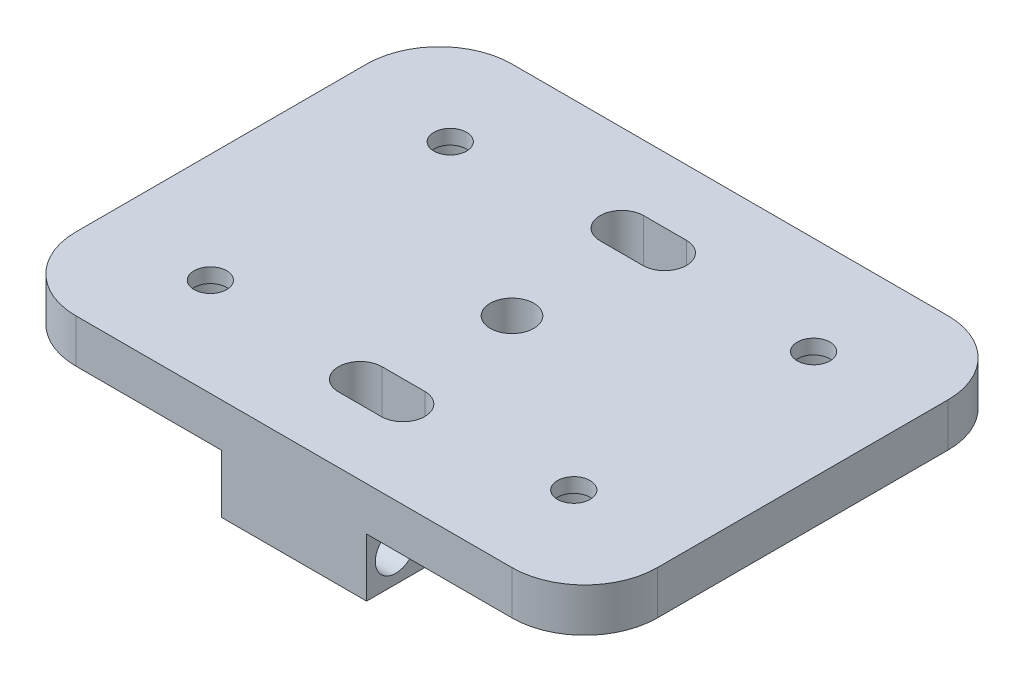
ISO-10303-21;
HEADER;
FILE_DESCRIPTION(('STEP AP214'),'2;1');
FILE_NAME('part.step','',(''),(''),'','','');
FILE_SCHEMA(('AUTOMOTIVE_DESIGN { 1 0 10303 214 1 1 1 1 }'));
ENDSEC;
DATA;
#1=APPLICATION_CONTEXT('core data for automotive mechanical design processes');
#2=APPLICATION_PROTOCOL_DEFINITION('international standard','automotive_design',2000,#1);
#3=PRODUCT_CONTEXT('',#1,'mechanical');
#4=PRODUCT('Part','Part','',(#3));
#5=PRODUCT_RELATED_PRODUCT_CATEGORY('part','',(#4));
#6=PRODUCT_DEFINITION_FORMATION('','',#4);
#7=PRODUCT_DEFINITION_CONTEXT('part definition',#1,'design');
#8=PRODUCT_DEFINITION('design','',#6,#7);
#9=PRODUCT_DEFINITION_SHAPE('','',#8);
#10=(LENGTH_UNIT() NAMED_UNIT(*) SI_UNIT(.MILLI.,.METRE.));
#11=(NAMED_UNIT(*) PLANE_ANGLE_UNIT() SI_UNIT($,.RADIAN.));
#12=(NAMED_UNIT(*) SI_UNIT($,.STERADIAN.) SOLID_ANGLE_UNIT());
#13=UNCERTAINTY_MEASURE_WITH_UNIT(LENGTH_MEASURE(1.E-05),#10,'distance_accuracy_value','');
#14=(GEOMETRIC_REPRESENTATION_CONTEXT(3) GLOBAL_UNCERTAINTY_ASSIGNED_CONTEXT((#13)) GLOBAL_UNIT_ASSIGNED_CONTEXT((#10,
#11,#12)) REPRESENTATION_CONTEXT('',''));
#15=CARTESIAN_POINT('',(0.,0.,0.));
#16=DIRECTION('',(0.,0.,1.));
#17=DIRECTION('',(1.,0.,0.));
#18=AXIS2_PLACEMENT_3D('',#15,#16,#17);
#19=CARTESIAN_POINT('',(-25.,6.,16.5));
#20=DIRECTION('',(0.,-1.,0.));
#21=DIRECTION('',(0.,0.,-1.));
#22=AXIS2_PLACEMENT_3D('',#19,#20,#21);
#23=CYLINDRICAL_SURFACE('',#22,2.25);
#24=CARTESIAN_POINT('',(-25.,6.,16.5));
#25=DIRECTION('',(0.,1.,0.));
#26=DIRECTION('',(0.,0.,1.));
#27=AXIS2_PLACEMENT_3D('',#24,#25,#26);
#28=CIRCLE('',#27,2.25);
#29=CARTESIAN_POINT('',(-25.,6.,18.75));
#30=VERTEX_POINT('',#29);
#31=EDGE_CURVE('E329',#30,#30,#28,.T.);
#32=ORIENTED_EDGE('',*,*,#31,.T.);
#33=EDGE_LOOP('',(#32));
#34=FACE_BOUND('',#33,.T.);
#35=CARTESIAN_POINT('',(-25.,4.,16.5));
#36=DIRECTION('',(0.,-1.,0.));
#37=DIRECTION('',(0.,0.,-1.));
#38=AXIS2_PLACEMENT_3D('',#35,#36,#37);
#39=CIRCLE('',#38,2.25);
#40=CARTESIAN_POINT('',(-25.,4.,14.25));
#41=VERTEX_POINT('',#40);
#42=EDGE_CURVE('E42',#41,#41,#39,.T.);
#43=ORIENTED_EDGE('',*,*,#42,.T.);
#44=EDGE_LOOP('',(#43));
#45=FACE_BOUND('',#44,.T.);
#46=ADVANCED_FACE('F38',(#34,#45),#23,.F.);
#47=CARTESIAN_POINT('',(25.,6.,16.5));
#48=DIRECTION('',(0.,-1.,0.));
#49=DIRECTION('',(0.,0.,-1.));
#50=AXIS2_PLACEMENT_3D('',#47,#48,#49);
#51=CYLINDRICAL_SURFACE('',#50,2.25);
#52=CARTESIAN_POINT('',(25.,6.,16.5));
#53=DIRECTION('',(0.,1.,0.));
#54=DIRECTION('',(0.,0.,1.));
#55=AXIS2_PLACEMENT_3D('',#52,#53,#54);
#56=CIRCLE('',#55,2.25);
#57=CARTESIAN_POINT('',(25.,6.,18.75));
#58=VERTEX_POINT('',#57);
#59=EDGE_CURVE('E326',#58,#58,#56,.T.);
#60=ORIENTED_EDGE('',*,*,#59,.T.);
#61=EDGE_LOOP('',(#60));
#62=FACE_BOUND('',#61,.T.);
#63=CARTESIAN_POINT('',(25.,4.,16.5));
#64=DIRECTION('',(0.,-1.,0.));
#65=DIRECTION('',(0.,0.,-1.));
#66=AXIS2_PLACEMENT_3D('',#63,#64,#65);
#67=CIRCLE('',#66,2.25);
#68=CARTESIAN_POINT('',(25.,4.,14.25));
#69=VERTEX_POINT('',#68);
#70=EDGE_CURVE('E402',#69,#69,#67,.T.);
#71=ORIENTED_EDGE('',*,*,#70,.T.);
#72=EDGE_LOOP('',(#71));
#73=FACE_BOUND('',#72,.T.);
#74=ADVANCED_FACE('F486',(#62,#73),#51,.F.);
#75=CARTESIAN_POINT('',(25.,6.,-16.5));
#76=DIRECTION('',(0.,-1.,0.));
#77=DIRECTION('',(0.,0.,-1.));
#78=AXIS2_PLACEMENT_3D('',#75,#76,#77);
#79=CYLINDRICAL_SURFACE('',#78,2.25);
#80=CARTESIAN_POINT('',(25.,6.,-16.5));
#81=DIRECTION('',(0.,1.,0.));
#82=DIRECTION('',(0.,0.,1.));
#83=AXIS2_PLACEMENT_3D('',#80,#81,#82);
#84=CIRCLE('',#83,2.25);
#85=CARTESIAN_POINT('',(25.,6.,-14.25));
#86=VERTEX_POINT('',#85);
#87=EDGE_CURVE('E322',#86,#86,#84,.T.);
#88=ORIENTED_EDGE('',*,*,#87,.T.);
#89=EDGE_LOOP('',(#88));
#90=FACE_BOUND('',#89,.T.);
#91=CARTESIAN_POINT('',(25.,4.,-16.5));
#92=DIRECTION('',(0.,-1.,0.));
#93=DIRECTION('',(0.,0.,-1.));
#94=AXIS2_PLACEMENT_3D('',#91,#92,#93);
#95=CIRCLE('',#94,2.25);
#96=CARTESIAN_POINT('',(25.,4.,-18.75));
#97=VERTEX_POINT('',#96);
#98=EDGE_CURVE('E400',#97,#97,#95,.T.);
#99=ORIENTED_EDGE('',*,*,#98,.T.);
#100=EDGE_LOOP('',(#99));
#101=FACE_BOUND('',#100,.T.);
#102=ADVANCED_FACE('F492',(#90,#101),#79,.F.);
#103=CARTESIAN_POINT('',(-25.,6.,-16.5));
#104=DIRECTION('',(0.,-1.,0.));
#105=DIRECTION('',(0.,0.,-1.));
#106=AXIS2_PLACEMENT_3D('',#103,#104,#105);
#107=CYLINDRICAL_SURFACE('',#106,2.25);
#108=CARTESIAN_POINT('',(-25.,6.,-16.5));
#109=DIRECTION('',(0.,1.,0.));
#110=DIRECTION('',(0.,0.,1.));
#111=AXIS2_PLACEMENT_3D('',#108,#109,#110);
#112=CIRCLE('',#111,2.25);
#113=CARTESIAN_POINT('',(-25.,6.,-14.25));
#114=VERTEX_POINT('',#113);
#115=EDGE_CURVE('E319',#114,#114,#112,.T.);
#116=ORIENTED_EDGE('',*,*,#115,.T.);
#117=EDGE_LOOP('',(#116));
#118=FACE_BOUND('',#117,.T.);
#119=CARTESIAN_POINT('',(-25.,4.,-16.5));
#120=DIRECTION('',(0.,-1.,0.));
#121=DIRECTION('',(0.,0.,-1.));
#122=AXIS2_PLACEMENT_3D('',#119,#120,#121);
#123=CIRCLE('',#122,2.25);
#124=CARTESIAN_POINT('',(-25.,4.,-18.75));
#125=VERTEX_POINT('',#124);
#126=EDGE_CURVE('E285',#125,#125,#123,.T.);
#127=ORIENTED_EDGE('',*,*,#126,.T.);
#128=EDGE_LOOP('',(#127));
#129=FACE_BOUND('',#128,.T.);
#130=ADVANCED_FACE('F40',(#118,#129),#107,.F.);
#131=CARTESIAN_POINT('',(0.,0.,0.));
#132=DIRECTION('',(0.,1.,0.));
#133=DIRECTION('',(0.,0.,1.));
#134=AXIS2_PLACEMENT_3D('',#131,#132,#133);
#135=PLANE('',#134);
#136=CARTESIAN_POINT('',(-25.,0.,-16.5));
#137=DIRECTION('',(0.,-1.,0.));
#138=DIRECTION('',(0.,0.,-1.));
#139=AXIS2_PLACEMENT_3D('',#136,#137,#138);
#140=CIRCLE('',#139,4.);
#141=CARTESIAN_POINT('',(-25.,0.,-20.5));
#142=VERTEX_POINT('',#141);
#143=EDGE_CURVE('E255',#142,#142,#140,.T.);
#144=ORIENTED_EDGE('',*,*,#143,.F.);
#145=EDGE_LOOP('',(#144));
#146=FACE_BOUND('',#145,.T.);
#147=CARTESIAN_POINT('',(-25.,0.,16.5));
#148=DIRECTION('',(0.,-1.,0.));
#149=DIRECTION('',(0.,0.,-1.));
#150=AXIS2_PLACEMENT_3D('',#147,#148,#149);
#151=CIRCLE('',#150,4.);
#152=CARTESIAN_POINT('',(-25.,0.,12.5));
#153=VERTEX_POINT('',#152);
#154=EDGE_CURVE('E267',#153,#153,#151,.T.);
#155=ORIENTED_EDGE('',*,*,#154,.F.);
#156=EDGE_LOOP('',(#155));
#157=FACE_BOUND('',#156,.T.);
#158=DIRECTION('',(0.,0.,-1.));
#159=VECTOR('',#158,1.);
#160=CARTESIAN_POINT('',(-10.,0.,30.));
#161=LINE('',#160,#159);
#162=CARTESIAN_POINT('',(-10.,0.,30.));
#163=VERTEX_POINT('',#162);
#164=CARTESIAN_POINT('',(-10.,0.,-30.));
#165=VERTEX_POINT('',#164);
#166=EDGE_CURVE('E291',#163,#165,#161,.T.);
#167=ORIENTED_EDGE('',*,*,#166,.F.);
#168=DIRECTION('',(1.,0.,0.));
#169=VECTOR('',#168,1.);
#170=CARTESIAN_POINT('',(0.,0.,30.));
#171=LINE('',#170,#169);
#172=CARTESIAN_POINT('',(-30.,0.,30.));
#173=VERTEX_POINT('',#172);
#174=EDGE_CURVE('E374',#173,#163,#171,.T.);
#175=ORIENTED_EDGE('',*,*,#174,.F.);
#176=CARTESIAN_POINT('',(-30.,0.,20.));
#177=DIRECTION('',(0.,1.,0.));
#178=DIRECTION('',(0.,0.,1.));
#179=AXIS2_PLACEMENT_3D('',#176,#177,#178);
#180=CIRCLE('',#179,9.99999999999999);
#181=CARTESIAN_POINT('',(-40.,0.,20.));
#182=VERTEX_POINT('',#181);
#183=EDGE_CURVE('E370',#182,#173,#180,.T.);
#184=ORIENTED_EDGE('',*,*,#183,.F.);
#185=DIRECTION('',(0.,0.,1.));
#186=VECTOR('',#185,1.);
#187=CARTESIAN_POINT('',(-40.,0.,0.));
#188=LINE('',#187,#186);
#189=CARTESIAN_POINT('',(-40.,0.,-20.));
#190=VERTEX_POINT('',#189);
#191=EDGE_CURVE('E367',#190,#182,#188,.T.);
#192=ORIENTED_EDGE('',*,*,#191,.F.);
#193=CARTESIAN_POINT('',(-30.,0.,-20.));
#194=DIRECTION('',(0.,1.,0.));
#195=DIRECTION('',(0.,0.,1.));
#196=AXIS2_PLACEMENT_3D('',#193,#194,#195);
#197=CIRCLE('',#196,10.);
#198=CARTESIAN_POINT('',(-30.,0.,-30.));
#199=VERTEX_POINT('',#198);
#200=EDGE_CURVE('E364',#199,#190,#197,.T.);
#201=ORIENTED_EDGE('',*,*,#200,.F.);
#202=DIRECTION('',(1.,0.,0.));
#203=VECTOR('',#202,1.);
#204=CARTESIAN_POINT('',(0.,0.,-30.));
#205=LINE('',#204,#203);
#206=EDGE_CURVE('E362',#199,#165,#205,.T.);
#207=ORIENTED_EDGE('',*,*,#206,.T.);
#208=EDGE_LOOP('',(#167,#175,#184,#192,#201,#207));
#209=FACE_BOUND('',#208,.T.);
#210=ADVANCED_FACE('F424',(#146,#157,#209),#135,.F.);
#211=CARTESIAN_POINT('',(25.,0.,-16.5));
#212=DIRECTION('',(0.,-1.,0.));
#213=DIRECTION('',(0.,0.,-1.));
#214=AXIS2_PLACEMENT_3D('',#211,#212,#213);
#215=CIRCLE('',#214,4.);
#216=CARTESIAN_POINT('',(25.,0.,-20.5));
#217=VERTEX_POINT('',#216);
#218=EDGE_CURVE('E274',#217,#217,#215,.T.);
#219=ORIENTED_EDGE('',*,*,#218,.F.);
#220=EDGE_LOOP('',(#219));
#221=FACE_BOUND('',#220,.T.);
#222=CARTESIAN_POINT('',(25.,0.,16.5));
#223=DIRECTION('',(0.,-1.,0.));
#224=DIRECTION('',(0.,0.,-1.));
#225=AXIS2_PLACEMENT_3D('',#222,#223,#224);
#226=CIRCLE('',#225,4.);
#227=CARTESIAN_POINT('',(25.,0.,12.5));
#228=VERTEX_POINT('',#227);
#229=EDGE_CURVE('E268',#228,#228,#226,.T.);
#230=ORIENTED_EDGE('',*,*,#229,.F.);
#231=EDGE_LOOP('',(#230));
#232=FACE_BOUND('',#231,.T.);
#233=DIRECTION('',(0.,0.,1.));
#234=VECTOR('',#233,1.);
#235=CARTESIAN_POINT('',(9.99999999999999,0.,30.));
#236=LINE('',#235,#234);
#237=CARTESIAN_POINT('',(10.,0.,-30.));
#238=VERTEX_POINT('',#237);
#239=CARTESIAN_POINT('',(9.99999999999999,0.,30.));
#240=VERTEX_POINT('',#239);
#241=EDGE_CURVE('E296',#238,#240,#236,.T.);
#242=ORIENTED_EDGE('',*,*,#241,.F.);
#243=CARTESIAN_POINT('',(30.,0.,-30.));
#244=VERTEX_POINT('',#243);
#245=EDGE_CURVE('E361',#238,#244,#205,.T.);
#246=ORIENTED_EDGE('',*,*,#245,.T.);
#247=CARTESIAN_POINT('',(30.,0.,-20.));
#248=DIRECTION('',(0.,1.,0.));
#249=DIRECTION('',(0.,0.,1.));
#250=AXIS2_PLACEMENT_3D('',#247,#248,#249);
#251=CIRCLE('',#250,10.);
#252=CARTESIAN_POINT('',(40.,0.,-20.));
#253=VERTEX_POINT('',#252);
#254=EDGE_CURVE('E318',#244,#253,#251,.F.);
#255=ORIENTED_EDGE('',*,*,#254,.T.);
#256=DIRECTION('',(0.,0.,1.));
#257=VECTOR('',#256,1.);
#258=CARTESIAN_POINT('',(40.,0.,0.));
#259=LINE('',#258,#257);
#260=CARTESIAN_POINT('',(40.,0.,20.));
#261=VERTEX_POINT('',#260);
#262=EDGE_CURVE('E323',#253,#261,#259,.T.);
#263=ORIENTED_EDGE('',*,*,#262,.T.);
#264=CARTESIAN_POINT('',(30.,0.,20.));
#265=DIRECTION('',(0.,1.,0.));
#266=DIRECTION('',(0.,0.,1.));
#267=AXIS2_PLACEMENT_3D('',#264,#265,#266);
#268=CIRCLE('',#267,9.99999999999999);
#269=CARTESIAN_POINT('',(30.,0.,30.));
#270=VERTEX_POINT('',#269);
#271=EDGE_CURVE('E377',#270,#261,#268,.T.);
#272=ORIENTED_EDGE('',*,*,#271,.F.);
#273=EDGE_CURVE('E373',#240,#270,#171,.T.);
#274=ORIENTED_EDGE('',*,*,#273,.F.);
#275=EDGE_LOOP('',(#242,#246,#255,#263,#272,#274));
#276=FACE_BOUND('',#275,.T.);
#277=ADVANCED_FACE('F427',(#221,#232,#276),#135,.F.);
#278=CARTESIAN_POINT('',(30.,6.,-20.));
#279=DIRECTION('',(0.,-1.,0.));
#280=DIRECTION('',(0.,0.,-1.));
#281=AXIS2_PLACEMENT_3D('',#278,#279,#280);
#282=CYLINDRICAL_SURFACE('',#281,10.);
#283=ORIENTED_EDGE('',*,*,#254,.F.);
#284=DIRECTION('',(0.,-1.,0.));
#285=VECTOR('',#284,1.);
#286=CARTESIAN_POINT('',(30.,6.,-30.));
#287=LINE('',#286,#285);
#288=CARTESIAN_POINT('',(30.,6.,-30.));
#289=VERTEX_POINT('',#288);
#290=EDGE_CURVE('E11',#289,#244,#287,.T.);
#291=ORIENTED_EDGE('',*,*,#290,.F.);
#292=CARTESIAN_POINT('',(30.,6.,-20.));
#293=DIRECTION('',(0.,1.,0.));
#294=DIRECTION('',(0.,0.,1.));
#295=AXIS2_PLACEMENT_3D('',#292,#293,#294);
#296=CIRCLE('',#295,10.);
#297=CARTESIAN_POINT('',(40.,6.,-20.));
#298=VERTEX_POINT('',#297);
#299=EDGE_CURVE('E335',#289,#298,#296,.F.);
#300=ORIENTED_EDGE('',*,*,#299,.T.);
#301=DIRECTION('',(0.,-1.,0.));
#302=VECTOR('',#301,1.);
#303=CARTESIAN_POINT('',(40.,6.,-20.));
#304=LINE('',#303,#302);
#305=EDGE_CURVE('E358',#298,#253,#304,.T.);
#306=ORIENTED_EDGE('',*,*,#305,.T.);
#307=EDGE_LOOP('',(#283,#291,#300,#306));
#308=FACE_BOUND('',#307,.T.);
#309=ADVANCED_FACE('F459',(#308),#282,.T.);
#310=CARTESIAN_POINT('',(0.,6.,-30.));
#311=DIRECTION('',(0.,0.,-1.));
#312=DIRECTION('',(-1.,0.,0.));
#313=AXIS2_PLACEMENT_3D('',#310,#311,#312);
#314=PLANE('',#313);
#315=ORIENTED_EDGE('',*,*,#206,.F.);
#316=DIRECTION('',(0.,-1.,0.));
#317=VECTOR('',#316,1.);
#318=CARTESIAN_POINT('',(-30.,6.,-30.));
#319=LINE('',#318,#317);
#320=CARTESIAN_POINT('',(-30.,6.,-30.));
#321=VERTEX_POINT('',#320);
#322=EDGE_CURVE('E47',#321,#199,#319,.T.);
#323=ORIENTED_EDGE('',*,*,#322,.F.);
#324=DIRECTION('',(1.,0.,0.));
#325=VECTOR('',#324,1.);
#326=CARTESIAN_POINT('',(0.,6.,-30.));
#327=LINE('',#326,#325);
#328=EDGE_CURVE('E338',#321,#289,#327,.T.);
#329=ORIENTED_EDGE('',*,*,#328,.T.);
#330=ORIENTED_EDGE('',*,*,#290,.T.);
#331=ORIENTED_EDGE('',*,*,#245,.F.);
#332=DIRECTION('',(0.,1.,0.));
#333=VECTOR('',#332,1.);
#334=CARTESIAN_POINT('',(10.,-8.,-30.));
#335=LINE('',#334,#333);
#336=CARTESIAN_POINT('',(10.,-8.,-30.));
#337=VERTEX_POINT('',#336);
#338=EDGE_CURVE('E312',#337,#238,#335,.T.);
#339=ORIENTED_EDGE('',*,*,#338,.F.);
#340=DIRECTION('',(1.,0.,0.));
#341=VECTOR('',#340,1.);
#342=CARTESIAN_POINT('',(-10.,-8.,-30.));
#343=LINE('',#342,#341);
#344=CARTESIAN_POINT('',(-10.,-8.,-30.));
#345=VERTEX_POINT('',#344);
#346=EDGE_CURVE('E295',#345,#337,#343,.T.);
#347=ORIENTED_EDGE('',*,*,#346,.F.);
#348=DIRECTION('',(0.,1.,0.));
#349=VECTOR('',#348,1.);
#350=CARTESIAN_POINT('',(-10.,-8.,-30.));
#351=LINE('',#350,#349);
#352=EDGE_CURVE('E315',#345,#165,#351,.T.);
#353=ORIENTED_EDGE('',*,*,#352,.T.);
#354=EDGE_LOOP('',(#315,#323,#329,#330,#331,#339,#347,#353));
#355=FACE_BOUND('',#354,.T.);
#356=ADVANCED_FACE('F454',(#355),#314,.T.);
#357=CARTESIAN_POINT('',(-30.,6.,-20.));
#358=DIRECTION('',(0.,-1.,0.));
#359=DIRECTION('',(0.,0.,-1.));
#360=AXIS2_PLACEMENT_3D('',#357,#358,#359);
#361=CYLINDRICAL_SURFACE('',#360,10.);
#362=ORIENTED_EDGE('',*,*,#200,.T.);
#363=DIRECTION('',(0.,-1.,0.));
#364=VECTOR('',#363,1.);
#365=CARTESIAN_POINT('',(-40.,6.,-20.));
#366=LINE('',#365,#364);
#367=CARTESIAN_POINT('',(-40.,6.,-20.));
#368=VERTEX_POINT('',#367);
#369=EDGE_CURVE('E394',#368,#190,#366,.T.);
#370=ORIENTED_EDGE('',*,*,#369,.F.);
#371=CARTESIAN_POINT('',(-30.,6.,-20.));
#372=DIRECTION('',(0.,1.,0.));
#373=DIRECTION('',(0.,0.,1.));
#374=AXIS2_PLACEMENT_3D('',#371,#372,#373);
#375=CIRCLE('',#374,10.);
#376=EDGE_CURVE('E341',#321,#368,#375,.T.);
#377=ORIENTED_EDGE('',*,*,#376,.F.);
#378=ORIENTED_EDGE('',*,*,#322,.T.);
#379=EDGE_LOOP('',(#362,#370,#377,#378));
#380=FACE_BOUND('',#379,.T.);
#381=ADVANCED_FACE('F476',(#380),#361,.T.);
#382=CARTESIAN_POINT('',(-40.,6.,0.));
#383=DIRECTION('',(1.,0.,0.));
#384=DIRECTION('',(0.,0.,-1.));
#385=AXIS2_PLACEMENT_3D('',#382,#383,#384);
#386=PLANE('',#385);
#387=ORIENTED_EDGE('',*,*,#191,.T.);
#388=DIRECTION('',(0.,-1.,0.));
#389=VECTOR('',#388,1.);
#390=CARTESIAN_POINT('',(-40.,6.,20.));
#391=LINE('',#390,#389);
#392=CARTESIAN_POINT('',(-40.,6.,20.));
#393=VERTEX_POINT('',#392);
#394=EDGE_CURVE('E391',#393,#182,#391,.T.);
#395=ORIENTED_EDGE('',*,*,#394,.F.);
#396=DIRECTION('',(0.,0.,1.));
#397=VECTOR('',#396,1.);
#398=CARTESIAN_POINT('',(-40.,6.,0.));
#399=LINE('',#398,#397);
#400=EDGE_CURVE('E344',#368,#393,#399,.T.);
#401=ORIENTED_EDGE('',*,*,#400,.F.);
#402=ORIENTED_EDGE('',*,*,#369,.T.);
#403=EDGE_LOOP('',(#387,#395,#401,#402));
#404=FACE_BOUND('',#403,.T.);
#405=ADVANCED_FACE('F473',(#404),#386,.F.);
#406=CARTESIAN_POINT('',(-30.,6.,20.));
#407=DIRECTION('',(0.,-1.,0.));
#408=DIRECTION('',(0.,0.,-1.));
#409=AXIS2_PLACEMENT_3D('',#406,#407,#408);
#410=CYLINDRICAL_SURFACE('',#409,9.99999999999999);
#411=ORIENTED_EDGE('',*,*,#183,.T.);
#412=DIRECTION('',(0.,-1.,0.));
#413=VECTOR('',#412,1.);
#414=CARTESIAN_POINT('',(-30.,6.,30.));
#415=LINE('',#414,#413);
#416=CARTESIAN_POINT('',(-30.,6.,30.));
#417=VERTEX_POINT('',#416);
#418=EDGE_CURVE('E388',#417,#173,#415,.T.);
#419=ORIENTED_EDGE('',*,*,#418,.F.);
#420=CARTESIAN_POINT('',(-30.,6.,20.));
#421=DIRECTION('',(0.,1.,0.));
#422=DIRECTION('',(0.,0.,1.));
#423=AXIS2_PLACEMENT_3D('',#420,#421,#422);
#424=CIRCLE('',#423,9.99999999999999);
#425=EDGE_CURVE('E347',#393,#417,#424,.T.);
#426=ORIENTED_EDGE('',*,*,#425,.F.);
#427=ORIENTED_EDGE('',*,*,#394,.T.);
#428=EDGE_LOOP('',(#411,#419,#426,#427));
#429=FACE_BOUND('',#428,.T.);
#430=ADVANCED_FACE('F470',(#429),#410,.T.);
#431=CARTESIAN_POINT('',(0.,6.,30.));
#432=DIRECTION('',(0.,0.,-1.));
#433=DIRECTION('',(-1.,0.,0.));
#434=AXIS2_PLACEMENT_3D('',#431,#432,#433);
#435=PLANE('',#434);
#436=ORIENTED_EDGE('',*,*,#174,.T.);
#437=DIRECTION('',(0.,1.,0.));
#438=VECTOR('',#437,1.);
#439=CARTESIAN_POINT('',(-10.,-8.,30.));
#440=LINE('',#439,#438);
#441=CARTESIAN_POINT('',(-10.,-8.,30.));
#442=VERTEX_POINT('',#441);
#443=EDGE_CURVE('E302',#442,#163,#440,.T.);
#444=ORIENTED_EDGE('',*,*,#443,.F.);
#445=DIRECTION('',(-1.,0.,0.));
#446=VECTOR('',#445,1.);
#447=CARTESIAN_POINT('',(-10.,-8.,30.));
#448=LINE('',#447,#446);
#449=CARTESIAN_POINT('',(9.99999999999999,-8.,30.));
#450=VERTEX_POINT('',#449);
#451=EDGE_CURVE('E300',#450,#442,#448,.T.);
#452=ORIENTED_EDGE('',*,*,#451,.F.);
#453=DIRECTION('',(0.,1.,0.));
#454=VECTOR('',#453,1.);
#455=CARTESIAN_POINT('',(9.99999999999999,-8.,30.));
#456=LINE('',#455,#454);
#457=EDGE_CURVE('E309',#450,#240,#456,.T.);
#458=ORIENTED_EDGE('',*,*,#457,.T.);
#459=ORIENTED_EDGE('',*,*,#273,.T.);
#460=DIRECTION('',(0.,-1.,0.));
#461=VECTOR('',#460,1.);
#462=CARTESIAN_POINT('',(30.,6.,30.));
#463=LINE('',#462,#461);
#464=CARTESIAN_POINT('',(30.,6.,30.));
#465=VERTEX_POINT('',#464);
#466=EDGE_CURVE('E385',#465,#270,#463,.T.);
#467=ORIENTED_EDGE('',*,*,#466,.F.);
#468=DIRECTION('',(1.,0.,0.));
#469=VECTOR('',#468,1.);
#470=CARTESIAN_POINT('',(0.,6.,30.));
#471=LINE('',#470,#469);
#472=EDGE_CURVE('E350',#417,#465,#471,.T.);
#473=ORIENTED_EDGE('',*,*,#472,.F.);
#474=ORIENTED_EDGE('',*,*,#418,.T.);
#475=EDGE_LOOP('',(#436,#444,#452,#458,#459,#467,#473,#474));
#476=FACE_BOUND('',#475,.T.);
#477=ADVANCED_FACE('F436',(#476),#435,.F.);
#478=CARTESIAN_POINT('',(30.,6.,20.));
#479=DIRECTION('',(0.,-1.,0.));
#480=DIRECTION('',(0.,0.,-1.));
#481=AXIS2_PLACEMENT_3D('',#478,#479,#480);
#482=CYLINDRICAL_SURFACE('',#481,9.99999999999999);
#483=ORIENTED_EDGE('',*,*,#271,.T.);
#484=DIRECTION('',(0.,-1.,0.));
#485=VECTOR('',#484,1.);
#486=CARTESIAN_POINT('',(40.,6.,20.));
#487=LINE('',#486,#485);
#488=CARTESIAN_POINT('',(40.,6.,20.));
#489=VERTEX_POINT('',#488);
#490=EDGE_CURVE('E383',#489,#261,#487,.T.);
#491=ORIENTED_EDGE('',*,*,#490,.F.);
#492=CARTESIAN_POINT('',(30.,6.,20.));
#493=DIRECTION('',(0.,1.,0.));
#494=DIRECTION('',(0.,0.,1.));
#495=AXIS2_PLACEMENT_3D('',#492,#493,#494);
#496=CIRCLE('',#495,9.99999999999999);
#497=EDGE_CURVE('E353',#465,#489,#496,.T.);
#498=ORIENTED_EDGE('',*,*,#497,.F.);
#499=ORIENTED_EDGE('',*,*,#466,.T.);
#500=EDGE_LOOP('',(#483,#491,#498,#499));
#501=FACE_BOUND('',#500,.T.);
#502=ADVANCED_FACE('F466',(#501),#482,.T.);
#503=CARTESIAN_POINT('',(0.,6.,0.));
#504=DIRECTION('',(0.,-1.,0.));
#505=DIRECTION('',(0.,0.,-1.));
#506=AXIS2_PLACEMENT_3D('',#503,#504,#505);
#507=CYLINDRICAL_SURFACE('',#506,3.);
#508=CARTESIAN_POINT('',(0.,6.,0.));
#509=DIRECTION('',(0.,1.,0.));
#510=DIRECTION('',(0.,0.,1.));
#511=AXIS2_PLACEMENT_3D('',#508,#509,#510);
#512=CIRCLE('',#511,3.);
#513=CARTESIAN_POINT('',(0.,6.,3.));
#514=VERTEX_POINT('',#513);
#515=EDGE_CURVE('E332',#514,#514,#512,.T.);
#516=ORIENTED_EDGE('',*,*,#515,.T.);
#517=EDGE_LOOP('',(#516));
#518=FACE_BOUND('',#517,.T.);
#519=CARTESIAN_POINT('',(0.,-8.,0.));
#520=DIRECTION('',(0.,-1.,0.));
#521=DIRECTION('',(0.,0.,-1.));
#522=AXIS2_PLACEMENT_3D('',#519,#520,#521);
#523=CIRCLE('',#522,3.);
#524=CARTESIAN_POINT('',(0.,-8.,-3.));
#525=VERTEX_POINT('',#524);
#526=EDGE_CURVE('E288',#525,#525,#523,.T.);
#527=ORIENTED_EDGE('',*,*,#526,.T.);
#528=EDGE_LOOP('',(#527));
#529=FACE_BOUND('',#528,.T.);
#530=ADVANCED_FACE('F496',(#518,#529),#507,.F.);
#531=CARTESIAN_POINT('',(40.,6.,0.));
#532=DIRECTION('',(1.,0.,0.));
#533=DIRECTION('',(0.,0.,-1.));
#534=AXIS2_PLACEMENT_3D('',#531,#532,#533);
#535=PLANE('',#534);
#536=ORIENTED_EDGE('',*,*,#262,.F.);
#537=ORIENTED_EDGE('',*,*,#305,.F.);
#538=DIRECTION('',(0.,0.,1.));
#539=VECTOR('',#538,1.);
#540=CARTESIAN_POINT('',(40.,6.,0.));
#541=LINE('',#540,#539);
#542=EDGE_CURVE('E355',#298,#489,#541,.T.);
#543=ORIENTED_EDGE('',*,*,#542,.T.);
#544=ORIENTED_EDGE('',*,*,#490,.T.);
#545=EDGE_LOOP('',(#536,#537,#543,#544));
#546=FACE_BOUND('',#545,.T.);
#547=ADVANCED_FACE('F462',(#546),#535,.T.);
#548=CARTESIAN_POINT('',(0.,6.,0.));
#549=DIRECTION('',(0.,1.,0.));
#550=DIRECTION('',(0.,0.,1.));
#551=AXIS2_PLACEMENT_3D('',#548,#549,#550);
#552=PLANE('',#551);
#553=CARTESIAN_POINT('',(-2.87952613365418,6.,18.));
#554=DIRECTION('',(0.,-1.,0.));
#555=DIRECTION('',(0.,0.,-1.));
#556=AXIS2_PLACEMENT_3D('',#553,#554,#555);
#557=CIRCLE('',#556,3.);
#558=CARTESIAN_POINT('',(-2.87952613365419,6.,21.));
#559=VERTEX_POINT('',#558);
#560=CARTESIAN_POINT('',(-2.87952613365419,6.,15.));
#561=VERTEX_POINT('',#560);
#562=EDGE_CURVE('E181',#559,#561,#557,.T.);
#563=ORIENTED_EDGE('',*,*,#562,.T.);
#564=DIRECTION('',(1.,0.,0.));
#565=VECTOR('',#564,1.);
#566=CARTESIAN_POINT('',(-2.87952613365419,6.,15.));
#567=LINE('',#566,#565);
#568=CARTESIAN_POINT('',(3.00000000000001,6.,15.));
#569=VERTEX_POINT('',#568);
#570=EDGE_CURVE('E192',#561,#569,#567,.T.);
#571=ORIENTED_EDGE('',*,*,#570,.T.);
#572=CARTESIAN_POINT('',(3.00000000000001,6.,18.));
#573=DIRECTION('',(0.,-1.,0.));
#574=DIRECTION('',(0.,0.,-1.));
#575=AXIS2_PLACEMENT_3D('',#572,#573,#574);
#576=CIRCLE('',#575,3.);
#577=CARTESIAN_POINT('',(3.00000000000001,6.,21.));
#578=VERTEX_POINT('',#577);
#579=EDGE_CURVE('E55',#569,#578,#576,.T.);
#580=ORIENTED_EDGE('',*,*,#579,.T.);
#581=DIRECTION('',(-1.,0.,0.));
#582=VECTOR('',#581,1.);
#583=CARTESIAN_POINT('',(-2.87952613365419,6.,21.));
#584=LINE('',#583,#582);
#585=EDGE_CURVE('E189',#578,#559,#584,.T.);
#586=ORIENTED_EDGE('',*,*,#585,.T.);
#587=EDGE_LOOP('',(#563,#571,#580,#586));
#588=FACE_BOUND('',#587,.T.);
#589=CARTESIAN_POINT('',(-2.87952613365419,6.,-18.));
#590=DIRECTION('',(0.,-1.,0.));
#591=DIRECTION('',(0.,0.,-1.));
#592=AXIS2_PLACEMENT_3D('',#589,#590,#591);
#593=CIRCLE('',#592,3.);
#594=CARTESIAN_POINT('',(-2.87952613365419,6.,-15.));
#595=VERTEX_POINT('',#594);
#596=CARTESIAN_POINT('',(-2.87952613365419,6.,-21.));
#597=VERTEX_POINT('',#596);
#598=EDGE_CURVE('E222',#595,#597,#593,.T.);
#599=ORIENTED_EDGE('',*,*,#598,.T.);
#600=DIRECTION('',(1.,0.,0.));
#601=VECTOR('',#600,1.);
#602=CARTESIAN_POINT('',(-2.87952613365419,6.,-21.));
#603=LINE('',#602,#601);
#604=CARTESIAN_POINT('',(3.00000000000001,6.,-21.));
#605=VERTEX_POINT('',#604);
#606=EDGE_CURVE('E225',#597,#605,#603,.T.);
#607=ORIENTED_EDGE('',*,*,#606,.T.);
#608=CARTESIAN_POINT('',(3.00000000000001,6.,-18.));
#609=DIRECTION('',(0.,-1.,0.));
#610=DIRECTION('',(0.,0.,-1.));
#611=AXIS2_PLACEMENT_3D('',#608,#609,#610);
#612=CIRCLE('',#611,3.00000000000001);
#613=CARTESIAN_POINT('',(3.00000000000001,6.,-15.));
#614=VERTEX_POINT('',#613);
#615=EDGE_CURVE('E63',#605,#614,#612,.T.);
#616=ORIENTED_EDGE('',*,*,#615,.T.);
#617=DIRECTION('',(-1.,0.,0.));
#618=VECTOR('',#617,1.);
#619=CARTESIAN_POINT('',(-2.87952613365419,6.,-15.));
#620=LINE('',#619,#618);
#621=EDGE_CURVE('E230',#614,#595,#620,.T.);
#622=ORIENTED_EDGE('',*,*,#621,.T.);
#623=EDGE_LOOP('',(#599,#607,#616,#622));
#624=FACE_BOUND('',#623,.T.);
#625=ORIENTED_EDGE('',*,*,#115,.F.);
#626=EDGE_LOOP('',(#625));
#627=FACE_BOUND('',#626,.T.);
#628=ORIENTED_EDGE('',*,*,#87,.F.);
#629=EDGE_LOOP('',(#628));
#630=FACE_BOUND('',#629,.T.);
#631=ORIENTED_EDGE('',*,*,#59,.F.);
#632=EDGE_LOOP('',(#631));
#633=FACE_BOUND('',#632,.T.);
#634=ORIENTED_EDGE('',*,*,#31,.F.);
#635=EDGE_LOOP('',(#634));
#636=FACE_BOUND('',#635,.T.);
#637=ORIENTED_EDGE('',*,*,#515,.F.);
#638=EDGE_LOOP('',(#637));
#639=FACE_BOUND('',#638,.T.);
#640=ORIENTED_EDGE('',*,*,#299,.F.);
#641=ORIENTED_EDGE('',*,*,#328,.F.);
#642=ORIENTED_EDGE('',*,*,#376,.T.);
#643=ORIENTED_EDGE('',*,*,#400,.T.);
#644=ORIENTED_EDGE('',*,*,#425,.T.);
#645=ORIENTED_EDGE('',*,*,#472,.T.);
#646=ORIENTED_EDGE('',*,*,#497,.T.);
#647=ORIENTED_EDGE('',*,*,#542,.F.);
#648=EDGE_LOOP('',(#640,#641,#642,#643,#644,#645,#646,#647));
#649=FACE_BOUND('',#648,.T.);
#650=ADVANCED_FACE('F196',(#588,#624,#627,#630,#633,#636,#639,#649),#552,.T.);
#651=CARTESIAN_POINT('',(0.,-8.,0.));
#652=DIRECTION('',(0.,-1.,0.));
#653=DIRECTION('',(0.,0.,-1.));
#654=AXIS2_PLACEMENT_3D('',#651,#652,#653);
#655=PLANE('',#654);
#656=CARTESIAN_POINT('',(-2.87952613365418,-8.,18.));
#657=DIRECTION('',(0.,-1.,0.));
#658=DIRECTION('',(0.,0.,-1.));
#659=AXIS2_PLACEMENT_3D('',#656,#657,#658);
#660=CIRCLE('',#659,3.);
#661=CARTESIAN_POINT('',(-2.87952613365419,-8.,21.));
#662=VERTEX_POINT('',#661);
#663=CARTESIAN_POINT('',(-2.87952613365419,-8.,15.));
#664=VERTEX_POINT('',#663);
#665=EDGE_CURVE('E184',#662,#664,#660,.T.);
#666=ORIENTED_EDGE('',*,*,#665,.F.);
#667=DIRECTION('',(-1.,0.,0.));
#668=VECTOR('',#667,1.);
#669=CARTESIAN_POINT('',(-2.87952613365419,-8.,21.));
#670=LINE('',#669,#668);
#671=CARTESIAN_POINT('',(3.00000000000001,-8.,21.));
#672=VERTEX_POINT('',#671);
#673=EDGE_CURVE('E199',#672,#662,#670,.T.);
#674=ORIENTED_EDGE('',*,*,#673,.F.);
#675=CARTESIAN_POINT('',(3.00000000000001,-8.,18.));
#676=DIRECTION('',(0.,-1.,0.));
#677=DIRECTION('',(0.,0.,-1.));
#678=AXIS2_PLACEMENT_3D('',#675,#676,#677);
#679=CIRCLE('',#678,3.);
#680=CARTESIAN_POINT('',(3.00000000000001,-8.,15.));
#681=VERTEX_POINT('',#680);
#682=EDGE_CURVE('E202',#681,#672,#679,.T.);
#683=ORIENTED_EDGE('',*,*,#682,.F.);
#684=DIRECTION('',(1.,0.,0.));
#685=VECTOR('',#684,1.);
#686=CARTESIAN_POINT('',(-2.87952613365419,-8.,15.));
#687=LINE('',#686,#685);
#688=EDGE_CURVE('E211',#664,#681,#687,.T.);
#689=ORIENTED_EDGE('',*,*,#688,.F.);
#690=EDGE_LOOP('',(#666,#674,#683,#689));
#691=FACE_BOUND('',#690,.T.);
#692=CARTESIAN_POINT('',(-2.87952613365419,-8.,-18.));
#693=DIRECTION('',(0.,-1.,0.));
#694=DIRECTION('',(0.,0.,-1.));
#695=AXIS2_PLACEMENT_3D('',#692,#693,#694);
#696=CIRCLE('',#695,3.);
#697=CARTESIAN_POINT('',(-2.87952613365419,-8.,-15.));
#698=VERTEX_POINT('',#697);
#699=CARTESIAN_POINT('',(-2.87952613365419,-8.,-21.));
#700=VERTEX_POINT('',#699);
#701=EDGE_CURVE('E234',#698,#700,#696,.T.);
#702=ORIENTED_EDGE('',*,*,#701,.F.);
#703=DIRECTION('',(-1.,0.,0.));
#704=VECTOR('',#703,1.);
#705=CARTESIAN_POINT('',(-2.87952613365419,-8.,-15.));
#706=LINE('',#705,#704);
#707=CARTESIAN_POINT('',(3.00000000000001,-8.,-15.));
#708=VERTEX_POINT('',#707);
#709=EDGE_CURVE('E226',#708,#698,#706,.T.);
#710=ORIENTED_EDGE('',*,*,#709,.F.);
#711=CARTESIAN_POINT('',(3.00000000000001,-8.,-18.));
#712=DIRECTION('',(0.,-1.,0.));
#713=DIRECTION('',(0.,0.,-1.));
#714=AXIS2_PLACEMENT_3D('',#711,#712,#713);
#715=CIRCLE('',#714,3.00000000000001);
#716=CARTESIAN_POINT('',(3.00000000000001,-8.,-21.));
#717=VERTEX_POINT('',#716);
#718=EDGE_CURVE('E240',#717,#708,#715,.T.);
#719=ORIENTED_EDGE('',*,*,#718,.F.);
#720=DIRECTION('',(1.,0.,0.));
#721=VECTOR('',#720,1.);
#722=CARTESIAN_POINT('',(-2.87952613365419,-8.,-21.));
#723=LINE('',#722,#721);
#724=EDGE_CURVE('E236',#700,#717,#723,.T.);
#725=ORIENTED_EDGE('',*,*,#724,.F.);
#726=EDGE_LOOP('',(#702,#710,#719,#725));
#727=FACE_BOUND('',#726,.T.);
#728=DIRECTION('',(0.,0.,-1.));
#729=VECTOR('',#728,1.);
#730=CARTESIAN_POINT('',(-10.,-8.,30.));
#731=LINE('',#730,#729);
#732=EDGE_CURVE('E292',#442,#345,#731,.T.);
#733=ORIENTED_EDGE('',*,*,#732,.T.);
#734=ORIENTED_EDGE('',*,*,#346,.T.);
#735=DIRECTION('',(0.,0.,1.));
#736=VECTOR('',#735,1.);
#737=CARTESIAN_POINT('',(9.99999999999999,-8.,30.));
#738=LINE('',#737,#736);
#739=EDGE_CURVE('E298',#337,#450,#738,.T.);
#740=ORIENTED_EDGE('',*,*,#739,.T.);
#741=ORIENTED_EDGE('',*,*,#451,.T.);
#742=EDGE_LOOP('',(#733,#734,#740,#741));
#743=FACE_BOUND('',#742,.T.);
#744=ORIENTED_EDGE('',*,*,#526,.F.);
#745=EDGE_LOOP('',(#744));
#746=FACE_BOUND('',#745,.T.);
#747=ADVANCED_FACE('F442',(#691,#727,#743,#746),#655,.T.);
#748=CARTESIAN_POINT('',(-10.,-8.,30.));
#749=DIRECTION('',(1.,0.,0.));
#750=DIRECTION('',(0.,0.,-1.));
#751=AXIS2_PLACEMENT_3D('',#748,#749,#750);
#752=PLANE('',#751);
#753=CARTESIAN_POINT('',(-10.,-3.87740140958037,26.));
#754=DIRECTION('',(-1.,0.,0.));
#755=DIRECTION('',(0.,0.,1.));
#756=AXIS2_PLACEMENT_3D('',#753,#754,#755);
#757=CIRCLE('',#756,2.8);
#758=CARTESIAN_POINT('',(-10.,-3.87740140958037,28.8));
#759=VERTEX_POINT('',#758);
#760=EDGE_CURVE('E256',#759,#759,#757,.T.);
#761=ORIENTED_EDGE('',*,*,#760,.F.);
#762=EDGE_LOOP('',(#761));
#763=FACE_BOUND('',#762,.T.);
#764=CARTESIAN_POINT('',(-10.,-3.87740140958037,-26.));
#765=DIRECTION('',(-1.,0.,0.));
#766=DIRECTION('',(0.,0.,1.));
#767=AXIS2_PLACEMENT_3D('',#764,#765,#766);
#768=CIRCLE('',#767,2.80000000000001);
#769=CARTESIAN_POINT('',(-10.,-3.87740140958037,-23.2));
#770=VERTEX_POINT('',#769);
#771=EDGE_CURVE('E218',#770,#770,#768,.T.);
#772=ORIENTED_EDGE('',*,*,#771,.F.);
#773=EDGE_LOOP('',(#772));
#774=FACE_BOUND('',#773,.T.);
#775=ORIENTED_EDGE('',*,*,#166,.T.);
#776=ORIENTED_EDGE('',*,*,#352,.F.);
#777=ORIENTED_EDGE('',*,*,#732,.F.);
#778=ORIENTED_EDGE('',*,*,#443,.T.);
#779=EDGE_LOOP('',(#775,#776,#777,#778));
#780=FACE_BOUND('',#779,.T.);
#781=ADVANCED_FACE('F440',(#763,#774,#780),#752,.F.);
#782=CARTESIAN_POINT('',(9.99999999999999,-8.,30.));
#783=DIRECTION('',(-1.,0.,0.));
#784=DIRECTION('',(0.,0.,1.));
#785=AXIS2_PLACEMENT_3D('',#782,#783,#784);
#786=PLANE('',#785);
#787=CARTESIAN_POINT('',(10.,-3.88,26.));
#788=DIRECTION('',(1.,0.,0.));
#789=DIRECTION('',(0.,0.,-1.));
#790=AXIS2_PLACEMENT_3D('',#787,#788,#789);
#791=CIRCLE('',#790,2.8);
#792=CARTESIAN_POINT('',(10.,-3.88,23.2));
#793=VERTEX_POINT('',#792);
#794=EDGE_CURVE('E798',#793,#793,#791,.T.);
#795=ORIENTED_EDGE('',*,*,#794,.F.);
#796=EDGE_LOOP('',(#795));
#797=FACE_BOUND('',#796,.T.);
#798=CARTESIAN_POINT('',(10.,-3.88,-26.));
#799=DIRECTION('',(1.,0.,0.));
#800=DIRECTION('',(0.,0.,-1.));
#801=AXIS2_PLACEMENT_3D('',#798,#799,#800);
#802=CIRCLE('',#801,2.8);
#803=CARTESIAN_POINT('',(10.,-3.88,-28.8));
#804=VERTEX_POINT('',#803);
#805=EDGE_CURVE('E205',#804,#804,#802,.T.);
#806=ORIENTED_EDGE('',*,*,#805,.F.);
#807=EDGE_LOOP('',(#806));
#808=FACE_BOUND('',#807,.T.);
#809=ORIENTED_EDGE('',*,*,#241,.T.);
#810=ORIENTED_EDGE('',*,*,#457,.F.);
#811=ORIENTED_EDGE('',*,*,#739,.F.);
#812=ORIENTED_EDGE('',*,*,#338,.T.);
#813=EDGE_LOOP('',(#809,#810,#811,#812));
#814=FACE_BOUND('',#813,.T.);
#815=ADVANCED_FACE('F450',(#797,#808,#814),#786,.F.);
#816=CARTESIAN_POINT('',(-25.,4.,-16.5));
#817=DIRECTION('',(0.,-1.,0.));
#818=DIRECTION('',(0.,0.,-1.));
#819=AXIS2_PLACEMENT_3D('',#816,#817,#818);
#820=CYLINDRICAL_SURFACE('',#819,4.);
#821=CARTESIAN_POINT('',(-25.,4.,-16.5));
#822=DIRECTION('',(0.,-1.,0.));
#823=DIRECTION('',(0.,0.,-1.));
#824=AXIS2_PLACEMENT_3D('',#821,#822,#823);
#825=CIRCLE('',#824,4.);
#826=CARTESIAN_POINT('',(-25.,4.,-20.5));
#827=VERTEX_POINT('',#826);
#828=EDGE_CURVE('E277',#827,#827,#825,.T.);
#829=ORIENTED_EDGE('',*,*,#828,.F.);
#830=EDGE_LOOP('',(#829));
#831=FACE_BOUND('',#830,.T.);
#832=ORIENTED_EDGE('',*,*,#143,.T.);
#833=EDGE_LOOP('',(#832));
#834=FACE_BOUND('',#833,.T.);
#835=ADVANCED_FACE('F539',(#831,#834),#820,.F.);
#836=CARTESIAN_POINT('',(-25.,4.,-16.5));
#837=DIRECTION('',(0.,-1.,0.));
#838=DIRECTION('',(0.,0.,-1.));
#839=AXIS2_PLACEMENT_3D('',#836,#837,#838);
#840=PLANE('',#839);
#841=ORIENTED_EDGE('',*,*,#126,.F.);
#842=EDGE_LOOP('',(#841));
#843=FACE_BOUND('',#842,.T.);
#844=ORIENTED_EDGE('',*,*,#828,.T.);
#845=EDGE_LOOP('',(#844));
#846=FACE_BOUND('',#845,.T.);
#847=ADVANCED_FACE('F518',(#843,#846),#840,.T.);
#848=CARTESIAN_POINT('',(25.,4.,-16.5));
#849=DIRECTION('',(0.,-1.,0.));
#850=DIRECTION('',(0.,0.,-1.));
#851=AXIS2_PLACEMENT_3D('',#848,#849,#850);
#852=CYLINDRICAL_SURFACE('',#851,4.);
#853=CARTESIAN_POINT('',(25.,4.,-16.5));
#854=DIRECTION('',(0.,-1.,0.));
#855=DIRECTION('',(0.,0.,-1.));
#856=AXIS2_PLACEMENT_3D('',#853,#854,#855);
#857=CIRCLE('',#856,4.);
#858=CARTESIAN_POINT('',(25.,4.,-20.5));
#859=VERTEX_POINT('',#858);
#860=EDGE_CURVE('E271',#859,#859,#857,.T.);
#861=ORIENTED_EDGE('',*,*,#860,.F.);
#862=EDGE_LOOP('',(#861));
#863=FACE_BOUND('',#862,.T.);
#864=ORIENTED_EDGE('',*,*,#218,.T.);
#865=EDGE_LOOP('',(#864));
#866=FACE_BOUND('',#865,.T.);
#867=ADVANCED_FACE('F512',(#863,#866),#852,.F.);
#868=CARTESIAN_POINT('',(25.,4.,-16.5));
#869=DIRECTION('',(0.,-1.,0.));
#870=DIRECTION('',(0.,0.,-1.));
#871=AXIS2_PLACEMENT_3D('',#868,#869,#870);
#872=PLANE('',#871);
#873=ORIENTED_EDGE('',*,*,#98,.F.);
#874=EDGE_LOOP('',(#873));
#875=FACE_BOUND('',#874,.T.);
#876=ORIENTED_EDGE('',*,*,#860,.T.);
#877=EDGE_LOOP('',(#876));
#878=FACE_BOUND('',#877,.T.);
#879=ADVANCED_FACE('F508',(#875,#878),#872,.T.);
#880=CARTESIAN_POINT('',(25.,4.,16.5));
#881=DIRECTION('',(0.,-1.,0.));
#882=DIRECTION('',(0.,0.,-1.));
#883=AXIS2_PLACEMENT_3D('',#880,#881,#882);
#884=CYLINDRICAL_SURFACE('',#883,4.);
#885=CARTESIAN_POINT('',(25.,4.,16.5));
#886=DIRECTION('',(0.,-1.,0.));
#887=DIRECTION('',(0.,0.,-1.));
#888=AXIS2_PLACEMENT_3D('',#885,#886,#887);
#889=CIRCLE('',#888,4.);
#890=CARTESIAN_POINT('',(25.,4.,12.5));
#891=VERTEX_POINT('',#890);
#892=EDGE_CURVE('E264',#891,#891,#889,.T.);
#893=ORIENTED_EDGE('',*,*,#892,.F.);
#894=EDGE_LOOP('',(#893));
#895=FACE_BOUND('',#894,.T.);
#896=ORIENTED_EDGE('',*,*,#229,.T.);
#897=EDGE_LOOP('',(#896));
#898=FACE_BOUND('',#897,.T.);
#899=ADVANCED_FACE('F511',(#895,#898),#884,.F.);
#900=CARTESIAN_POINT('',(25.,4.,16.5));
#901=DIRECTION('',(0.,-1.,0.));
#902=DIRECTION('',(0.,0.,-1.));
#903=AXIS2_PLACEMENT_3D('',#900,#901,#902);
#904=PLANE('',#903);
#905=ORIENTED_EDGE('',*,*,#70,.F.);
#906=EDGE_LOOP('',(#905));
#907=FACE_BOUND('',#906,.T.);
#908=ORIENTED_EDGE('',*,*,#892,.T.);
#909=EDGE_LOOP('',(#908));
#910=FACE_BOUND('',#909,.T.);
#911=ADVANCED_FACE('F420',(#907,#910),#904,.T.);
#912=CARTESIAN_POINT('',(-25.,4.,16.5));
#913=DIRECTION('',(0.,-1.,0.));
#914=DIRECTION('',(0.,0.,-1.));
#915=AXIS2_PLACEMENT_3D('',#912,#913,#914);
#916=CYLINDRICAL_SURFACE('',#915,4.);
#917=CARTESIAN_POINT('',(-25.,4.,16.5));
#918=DIRECTION('',(0.,-1.,0.));
#919=DIRECTION('',(0.,0.,-1.));
#920=AXIS2_PLACEMENT_3D('',#917,#918,#919);
#921=CIRCLE('',#920,4.);
#922=CARTESIAN_POINT('',(-25.,4.,12.5));
#923=VERTEX_POINT('',#922);
#924=EDGE_CURVE('E282',#923,#923,#921,.T.);
#925=ORIENTED_EDGE('',*,*,#924,.F.);
#926=EDGE_LOOP('',(#925));
#927=FACE_BOUND('',#926,.T.);
#928=ORIENTED_EDGE('',*,*,#154,.T.);
#929=EDGE_LOOP('',(#928));
#930=FACE_BOUND('',#929,.T.);
#931=ADVANCED_FACE('F414',(#927,#930),#916,.F.);
#932=CARTESIAN_POINT('',(-25.,4.,16.5));
#933=DIRECTION('',(0.,-1.,0.));
#934=DIRECTION('',(0.,0.,-1.));
#935=AXIS2_PLACEMENT_3D('',#932,#933,#934);
#936=PLANE('',#935);
#937=ORIENTED_EDGE('',*,*,#42,.F.);
#938=EDGE_LOOP('',(#937));
#939=FACE_BOUND('',#938,.T.);
#940=ORIENTED_EDGE('',*,*,#924,.T.);
#941=EDGE_LOOP('',(#940));
#942=FACE_BOUND('',#941,.T.);
#943=ADVANCED_FACE('F410',(#939,#942),#936,.T.);
#944=CARTESIAN_POINT('',(-1.9,-3.87740140958037,-26.));
#945=DIRECTION('',(-1.,0.,0.));
#946=DIRECTION('',(0.,0.,1.));
#947=AXIS2_PLACEMENT_3D('',#944,#945,#946);
#948=CYLINDRICAL_SURFACE('',#947,2.80000000000001);
#949=CARTESIAN_POINT('',(-1.9,-3.87740140958037,-26.));
#950=DIRECTION('',(-1.,0.,0.));
#951=DIRECTION('',(0.,0.,1.));
#952=AXIS2_PLACEMENT_3D('',#949,#950,#951);
#953=CIRCLE('',#952,2.80000000000001);
#954=CARTESIAN_POINT('',(-1.9,-3.87740140958037,-23.2));
#955=VERTEX_POINT('',#954);
#956=EDGE_CURVE('E259',#955,#955,#953,.T.);
#957=ORIENTED_EDGE('',*,*,#956,.F.);
#958=EDGE_LOOP('',(#957));
#959=FACE_BOUND('',#958,.T.);
#960=ORIENTED_EDGE('',*,*,#771,.T.);
#961=EDGE_LOOP('',(#960));
#962=FACE_BOUND('',#961,.T.);
#963=ADVANCED_FACE('F413',(#959,#962),#948,.F.);
#964=CARTESIAN_POINT('',(-1.9,-3.87740140958037,-26.));
#965=DIRECTION('',(-1.,0.,0.));
#966=DIRECTION('',(0.,0.,1.));
#967=AXIS2_PLACEMENT_3D('',#964,#965,#966);
#968=PLANE('',#967);
#969=ORIENTED_EDGE('',*,*,#956,.T.);
#970=EDGE_LOOP('',(#969));
#971=FACE_BOUND('',#970,.T.);
#972=ADVANCED_FACE('F653',(#971),#968,.T.);
#973=CARTESIAN_POINT('',(-1.90000000000001,-3.87740140958037,26.));
#974=DIRECTION('',(-1.,0.,0.));
#975=DIRECTION('',(0.,0.,1.));
#976=AXIS2_PLACEMENT_3D('',#973,#974,#975);
#977=CYLINDRICAL_SURFACE('',#976,2.8);
#978=CARTESIAN_POINT('',(-1.90000000000001,-3.87740140958037,26.));
#979=DIRECTION('',(-1.,0.,0.));
#980=DIRECTION('',(0.,0.,1.));
#981=AXIS2_PLACEMENT_3D('',#978,#979,#980);
#982=CIRCLE('',#981,2.8);
#983=CARTESIAN_POINT('',(-1.90000000000001,-3.87740140958037,28.8));
#984=VERTEX_POINT('',#983);
#985=EDGE_CURVE('E252',#984,#984,#982,.T.);
#986=ORIENTED_EDGE('',*,*,#985,.F.);
#987=EDGE_LOOP('',(#986));
#988=FACE_BOUND('',#987,.T.);
#989=ORIENTED_EDGE('',*,*,#760,.T.);
#990=EDGE_LOOP('',(#989));
#991=FACE_BOUND('',#990,.T.);
#992=ADVANCED_FACE('F659',(#988,#991),#977,.F.);
#993=CARTESIAN_POINT('',(-1.90000000000001,-3.87740140958037,26.));
#994=DIRECTION('',(-1.,0.,0.));
#995=DIRECTION('',(0.,0.,1.));
#996=AXIS2_PLACEMENT_3D('',#993,#994,#995);
#997=PLANE('',#996);
#998=ORIENTED_EDGE('',*,*,#985,.T.);
#999=EDGE_LOOP('',(#998));
#1000=FACE_BOUND('',#999,.T.);
#1001=ADVANCED_FACE('F667',(#1000),#997,.T.);
#1002=CARTESIAN_POINT('',(-2.87952613365419,6.,-18.));
#1003=DIRECTION('',(0.,-1.,0.));
#1004=DIRECTION('',(0.,0.,-1.));
#1005=AXIS2_PLACEMENT_3D('',#1002,#1003,#1004);
#1006=CYLINDRICAL_SURFACE('',#1005,3.);
#1007=ORIENTED_EDGE('',*,*,#701,.T.);
#1008=DIRECTION('',(0.,-1.,0.));
#1009=VECTOR('',#1008,1.);
#1010=CARTESIAN_POINT('',(-2.87952613365419,6.,-21.));
#1011=LINE('',#1010,#1009);
#1012=EDGE_CURVE('E233',#597,#700,#1011,.T.);
#1013=ORIENTED_EDGE('',*,*,#1012,.F.);
#1014=ORIENTED_EDGE('',*,*,#598,.F.);
#1015=DIRECTION('',(0.,-1.,0.));
#1016=VECTOR('',#1015,1.);
#1017=CARTESIAN_POINT('',(-2.87952613365419,6.,-15.));
#1018=LINE('',#1017,#1016);
#1019=EDGE_CURVE('E212',#595,#698,#1018,.T.);
#1020=ORIENTED_EDGE('',*,*,#1019,.T.);
#1021=EDGE_LOOP('',(#1007,#1013,#1014,#1020));
#1022=FACE_BOUND('',#1021,.T.);
#1023=ADVANCED_FACE('F674',(#1022),#1006,.F.);
#1024=CARTESIAN_POINT('',(-2.87952613365419,6.,-15.));
#1025=DIRECTION('',(0.,0.,1.));
#1026=DIRECTION('',(1.,0.,0.));
#1027=AXIS2_PLACEMENT_3D('',#1024,#1025,#1026);
#1028=PLANE('',#1027);
#1029=ORIENTED_EDGE('',*,*,#709,.T.);
#1030=ORIENTED_EDGE('',*,*,#1019,.F.);
#1031=ORIENTED_EDGE('',*,*,#621,.F.);
#1032=DIRECTION('',(0.,-1.,0.));
#1033=VECTOR('',#1032,1.);
#1034=CARTESIAN_POINT('',(3.00000000000001,6.,-15.));
#1035=LINE('',#1034,#1033);
#1036=EDGE_CURVE('E246',#614,#708,#1035,.T.);
#1037=ORIENTED_EDGE('',*,*,#1036,.T.);
#1038=EDGE_LOOP('',(#1029,#1030,#1031,#1037));
#1039=FACE_BOUND('',#1038,.T.);
#1040=ADVANCED_FACE('F681',(#1039),#1028,.F.);
#1041=CARTESIAN_POINT('',(3.00000000000001,6.,-18.));
#1042=DIRECTION('',(0.,-1.,0.));
#1043=DIRECTION('',(0.,0.,-1.));
#1044=AXIS2_PLACEMENT_3D('',#1041,#1042,#1043);
#1045=CYLINDRICAL_SURFACE('',#1044,3.00000000000001);
#1046=ORIENTED_EDGE('',*,*,#718,.T.);
#1047=ORIENTED_EDGE('',*,*,#1036,.F.);
#1048=ORIENTED_EDGE('',*,*,#615,.F.);
#1049=DIRECTION('',(0.,-1.,0.));
#1050=VECTOR('',#1049,1.);
#1051=CARTESIAN_POINT('',(3.00000000000001,6.,-21.));
#1052=LINE('',#1051,#1050);
#1053=EDGE_CURVE('E248',#605,#717,#1052,.T.);
#1054=ORIENTED_EDGE('',*,*,#1053,.T.);
#1055=EDGE_LOOP('',(#1046,#1047,#1048,#1054));
#1056=FACE_BOUND('',#1055,.T.);
#1057=ADVANCED_FACE('F689',(#1056),#1045,.F.);
#1058=CARTESIAN_POINT('',(-2.87952613365419,6.,-21.));
#1059=DIRECTION('',(0.,0.,-1.));
#1060=DIRECTION('',(-1.,0.,0.));
#1061=AXIS2_PLACEMENT_3D('',#1058,#1059,#1060);
#1062=PLANE('',#1061);
#1063=ORIENTED_EDGE('',*,*,#724,.T.);
#1064=ORIENTED_EDGE('',*,*,#1053,.F.);
#1065=ORIENTED_EDGE('',*,*,#606,.F.);
#1066=ORIENTED_EDGE('',*,*,#1012,.T.);
#1067=EDGE_LOOP('',(#1063,#1064,#1065,#1066));
#1068=FACE_BOUND('',#1067,.T.);
#1069=ADVANCED_FACE('F697',(#1068),#1062,.F.);
#1070=CARTESIAN_POINT('',(-2.87952613365418,6.,18.));
#1071=DIRECTION('',(0.,-1.,0.));
#1072=DIRECTION('',(0.,0.,-1.));
#1073=AXIS2_PLACEMENT_3D('',#1070,#1071,#1072);
#1074=CYLINDRICAL_SURFACE('',#1073,3.);
#1075=ORIENTED_EDGE('',*,*,#665,.T.);
#1076=DIRECTION('',(0.,-1.,0.));
#1077=VECTOR('',#1076,1.);
#1078=CARTESIAN_POINT('',(-2.87952613365419,6.,15.));
#1079=LINE('',#1078,#1077);
#1080=EDGE_CURVE('E177',#561,#664,#1079,.T.);
#1081=ORIENTED_EDGE('',*,*,#1080,.F.);
#1082=ORIENTED_EDGE('',*,*,#562,.F.);
#1083=DIRECTION('',(0.,-1.,0.));
#1084=VECTOR('',#1083,1.);
#1085=CARTESIAN_POINT('',(-2.87952613365419,6.,21.));
#1086=LINE('',#1085,#1084);
#1087=EDGE_CURVE('E216',#559,#662,#1086,.T.);
#1088=ORIENTED_EDGE('',*,*,#1087,.T.);
#1089=EDGE_LOOP('',(#1075,#1081,#1082,#1088));
#1090=FACE_BOUND('',#1089,.T.);
#1091=ADVANCED_FACE('F179',(#1090),#1074,.F.);
#1092=CARTESIAN_POINT('',(-2.87952613365419,6.,21.));
#1093=DIRECTION('',(0.,0.,1.));
#1094=DIRECTION('',(1.,0.,0.));
#1095=AXIS2_PLACEMENT_3D('',#1092,#1093,#1094);
#1096=PLANE('',#1095);
#1097=ORIENTED_EDGE('',*,*,#673,.T.);
#1098=ORIENTED_EDGE('',*,*,#1087,.F.);
#1099=ORIENTED_EDGE('',*,*,#585,.F.);
#1100=DIRECTION('',(0.,-1.,0.));
#1101=VECTOR('',#1100,1.);
#1102=CARTESIAN_POINT('',(3.00000000000001,6.,21.));
#1103=LINE('',#1102,#1101);
#1104=EDGE_CURVE('E219',#578,#672,#1103,.T.);
#1105=ORIENTED_EDGE('',*,*,#1104,.T.);
#1106=EDGE_LOOP('',(#1097,#1098,#1099,#1105));
#1107=FACE_BOUND('',#1106,.T.);
#1108=ADVANCED_FACE('F711',(#1107),#1096,.F.);
#1109=CARTESIAN_POINT('',(3.00000000000001,6.,18.));
#1110=DIRECTION('',(0.,-1.,0.));
#1111=DIRECTION('',(0.,0.,-1.));
#1112=AXIS2_PLACEMENT_3D('',#1109,#1110,#1111);
#1113=CYLINDRICAL_SURFACE('',#1112,3.);
#1114=ORIENTED_EDGE('',*,*,#682,.T.);
#1115=ORIENTED_EDGE('',*,*,#1104,.F.);
#1116=ORIENTED_EDGE('',*,*,#579,.F.);
#1117=DIRECTION('',(0.,-1.,0.));
#1118=VECTOR('',#1117,1.);
#1119=CARTESIAN_POINT('',(3.00000000000001,6.,15.));
#1120=LINE('',#1119,#1118);
#1121=EDGE_CURVE('E188',#569,#681,#1120,.T.);
#1122=ORIENTED_EDGE('',*,*,#1121,.T.);
#1123=EDGE_LOOP('',(#1114,#1115,#1116,#1122));
#1124=FACE_BOUND('',#1123,.T.);
#1125=ADVANCED_FACE('F718',(#1124),#1113,.F.);
#1126=CARTESIAN_POINT('',(-2.87952613365419,6.,15.));
#1127=DIRECTION('',(0.,0.,-1.));
#1128=DIRECTION('',(-1.,0.,0.));
#1129=AXIS2_PLACEMENT_3D('',#1126,#1127,#1128);
#1130=PLANE('',#1129);
#1131=ORIENTED_EDGE('',*,*,#688,.T.);
#1132=ORIENTED_EDGE('',*,*,#1121,.F.);
#1133=ORIENTED_EDGE('',*,*,#570,.F.);
#1134=ORIENTED_EDGE('',*,*,#1080,.T.);
#1135=EDGE_LOOP('',(#1131,#1132,#1133,#1134));
#1136=FACE_BOUND('',#1135,.T.);
#1137=ADVANCED_FACE('F193',(#1136),#1130,.F.);
#1138=CARTESIAN_POINT('',(1.90000000000001,-3.88,-26.));
#1139=DIRECTION('',(1.,0.,0.));
#1140=DIRECTION('',(0.,0.,-1.));
#1141=AXIS2_PLACEMENT_3D('',#1138,#1139,#1140);
#1142=CYLINDRICAL_SURFACE('',#1141,2.8);
#1143=CARTESIAN_POINT('',(1.90000000000001,-3.88,-26.));
#1144=DIRECTION('',(1.,0.,0.));
#1145=DIRECTION('',(0.,0.,-1.));
#1146=AXIS2_PLACEMENT_3D('',#1143,#1144,#1145);
#1147=CIRCLE('',#1146,2.8);
#1148=CARTESIAN_POINT('',(1.90000000000001,-3.88,-28.8));
#1149=VERTEX_POINT('',#1148);
#1150=EDGE_CURVE('E801',#1149,#1149,#1147,.T.);
#1151=ORIENTED_EDGE('',*,*,#1150,.F.);
#1152=EDGE_LOOP('',(#1151));
#1153=FACE_BOUND('',#1152,.T.);
#1154=ORIENTED_EDGE('',*,*,#805,.T.);
#1155=EDGE_LOOP('',(#1154));
#1156=FACE_BOUND('',#1155,.T.);
#1157=ADVANCED_FACE('F731',(#1153,#1156),#1142,.F.);
#1158=CARTESIAN_POINT('',(1.90000000000001,-3.88,-26.));
#1159=DIRECTION('',(1.,0.,0.));
#1160=DIRECTION('',(0.,0.,-1.));
#1161=AXIS2_PLACEMENT_3D('',#1158,#1159,#1160);
#1162=PLANE('',#1161);
#1163=ORIENTED_EDGE('',*,*,#1150,.T.);
#1164=EDGE_LOOP('',(#1163));
#1165=FACE_BOUND('',#1164,.T.);
#1166=ADVANCED_FACE('F737',(#1165),#1162,.T.);
#1167=CARTESIAN_POINT('',(1.9,-3.88,26.));
#1168=DIRECTION('',(1.,0.,0.));
#1169=DIRECTION('',(0.,0.,-1.));
#1170=AXIS2_PLACEMENT_3D('',#1167,#1168,#1169);
#1171=CYLINDRICAL_SURFACE('',#1170,2.8);
#1172=CARTESIAN_POINT('',(1.9,-3.88,26.));
#1173=DIRECTION('',(1.,0.,0.));
#1174=DIRECTION('',(0.,0.,-1.));
#1175=AXIS2_PLACEMENT_3D('',#1172,#1173,#1174);
#1176=CIRCLE('',#1175,2.8);
#1177=CARTESIAN_POINT('',(1.9,-3.88,23.2));
#1178=VERTEX_POINT('',#1177);
#1179=EDGE_CURVE('E237',#1178,#1178,#1176,.T.);
#1180=ORIENTED_EDGE('',*,*,#1179,.F.);
#1181=EDGE_LOOP('',(#1180));
#1182=FACE_BOUND('',#1181,.T.);
#1183=ORIENTED_EDGE('',*,*,#794,.T.);
#1184=EDGE_LOOP('',(#1183));
#1185=FACE_BOUND('',#1184,.T.);
#1186=ADVANCED_FACE('F745',(#1182,#1185),#1171,.F.);
#1187=CARTESIAN_POINT('',(1.9,-3.88,26.));
#1188=DIRECTION('',(1.,0.,0.));
#1189=DIRECTION('',(0.,0.,-1.));
#1190=AXIS2_PLACEMENT_3D('',#1187,#1188,#1189);
#1191=PLANE('',#1190);
#1192=ORIENTED_EDGE('',*,*,#1179,.T.);
#1193=EDGE_LOOP('',(#1192));
#1194=FACE_BOUND('',#1193,.T.);
#1195=ADVANCED_FACE('F753',(#1194),#1191,.T.);
#1196=CLOSED_SHELL('',(#46,#74,#102,#130,#210,#277,#309,#356,#381,#405,#430,#477,#502,#530,#547,
#650,#747,#781,#815,#835,#847,#867,#879,#899,#911,#931,#943,#963,#972,#992,#1001,#1023,#1040,
#1057,#1069,#1091,#1108,#1125,#1137,#1157,#1166,#1186,#1195));
#1197=MANIFOLD_SOLID_BREP('B2',#1196);
#1198=ADVANCED_BREP_SHAPE_REPRESENTATION('',(#18,#1197),#14);
#1199=SHAPE_DEFINITION_REPRESENTATION(#9,#1198);
ENDSEC;
END-ISO-10303-21;
